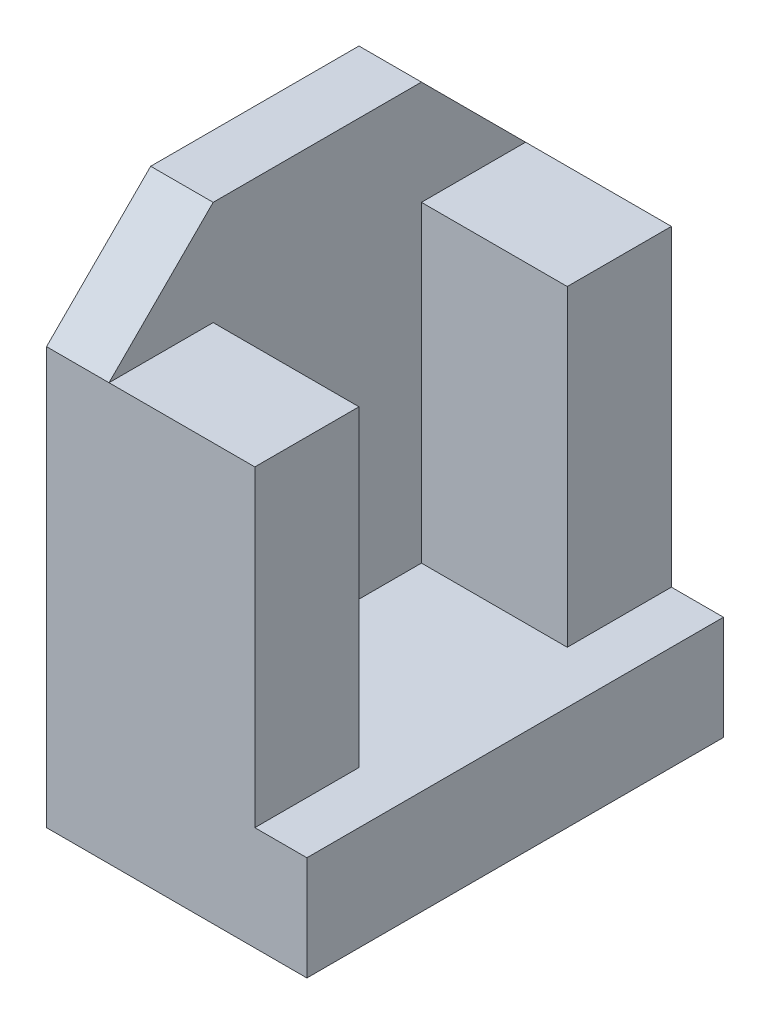
ISO-10303-21;
HEADER;
FILE_DESCRIPTION(('STEP AP214'),'2;1');
FILE_NAME('part.step','',(''),(''),'','','');
FILE_SCHEMA(('AUTOMOTIVE_DESIGN { 1 0 10303 214 1 1 1 1 }'));
ENDSEC;
DATA;
#1=APPLICATION_CONTEXT('core data for automotive mechanical design processes');
#2=APPLICATION_PROTOCOL_DEFINITION('international standard','automotive_design',2000,#1);
#3=PRODUCT_CONTEXT('',#1,'mechanical');
#4=PRODUCT('Part','Part','',(#3));
#5=PRODUCT_RELATED_PRODUCT_CATEGORY('part','',(#4));
#6=PRODUCT_DEFINITION_FORMATION('','',#4);
#7=PRODUCT_DEFINITION_CONTEXT('part definition',#1,'design');
#8=PRODUCT_DEFINITION('design','',#6,#7);
#9=PRODUCT_DEFINITION_SHAPE('','',#8);
#10=(LENGTH_UNIT() NAMED_UNIT(*) SI_UNIT(.MILLI.,.METRE.));
#11=(NAMED_UNIT(*) PLANE_ANGLE_UNIT() SI_UNIT($,.RADIAN.));
#12=(NAMED_UNIT(*) SI_UNIT($,.STERADIAN.) SOLID_ANGLE_UNIT());
#13=UNCERTAINTY_MEASURE_WITH_UNIT(LENGTH_MEASURE(1.E-05),#10,'distance_accuracy_value','');
#14=(GEOMETRIC_REPRESENTATION_CONTEXT(3) GLOBAL_UNCERTAINTY_ASSIGNED_CONTEXT((#13)) GLOBAL_UNIT_ASSIGNED_CONTEXT((#10,
#11,#12)) REPRESENTATION_CONTEXT('',''));
#15=CARTESIAN_POINT('',(0.,0.,0.));
#16=DIRECTION('',(0.,0.,1.));
#17=DIRECTION('',(1.,0.,0.));
#18=AXIS2_PLACEMENT_3D('',#15,#16,#17);
#19=CARTESIAN_POINT('',(6000.00000000001,0.,-40000.));
#20=DIRECTION('',(1.,0.,0.));
#21=DIRECTION('',(0.,0.,-1.));
#22=AXIS2_PLACEMENT_3D('',#19,#20,#21);
#23=PLANE('',#22);
#24=DIRECTION('',(0.,-1.,0.));
#25=VECTOR('',#24,1.);
#26=CARTESIAN_POINT('',(6000.00000000001,10000.,-30000.));
#27=LINE('',#26,#25);
#28=CARTESIAN_POINT('',(6000.00000000001,40000.,-30000.));
#29=VERTEX_POINT('',#28);
#30=CARTESIAN_POINT('',(6000.00000000001,10000.,-30000.));
#31=VERTEX_POINT('',#30);
#32=EDGE_CURVE('E52',#29,#31,#27,.T.);
#33=ORIENTED_EDGE('',*,*,#32,.F.);
#34=DIRECTION('',(0.,0.,1.));
#35=VECTOR('',#34,1.);
#36=CARTESIAN_POINT('',(6000.00000000001,40000.,-40000.));
#37=LINE('',#36,#35);
#38=CARTESIAN_POINT('',(6000.00000000001,40000.,-40000.));
#39=VERTEX_POINT('',#38);
#40=EDGE_CURVE('E252',#39,#29,#37,.T.);
#41=ORIENTED_EDGE('',*,*,#40,.F.);
#42=DIRECTION('',(0.,0.707106781186547,0.707106781186547));
#43=VECTOR('',#42,1.);
#44=CARTESIAN_POINT('',(6000.,50000.,-30000.));
#45=LINE('',#44,#43);
#46=CARTESIAN_POINT('',(6000.,50000.,-30000.));
#47=VERTEX_POINT('',#46);
#48=EDGE_CURVE('E192',#39,#47,#45,.T.);
#49=ORIENTED_EDGE('',*,*,#48,.T.);
#50=DIRECTION('',(0.,0.,1.));
#51=VECTOR('',#50,1.);
#52=CARTESIAN_POINT('',(6000.00000000001,50000.,-40000.));
#53=LINE('',#52,#51);
#54=CARTESIAN_POINT('',(6000.,50000.,-10000.));
#55=VERTEX_POINT('',#54);
#56=EDGE_CURVE('E11',#47,#55,#53,.T.);
#57=ORIENTED_EDGE('',*,*,#56,.T.);
#58=DIRECTION('',(0.,-0.707106781186547,0.707106781186547));
#59=VECTOR('',#58,1.);
#60=CARTESIAN_POINT('',(6000.,40000.,0.));
#61=LINE('',#60,#59);
#62=CARTESIAN_POINT('',(6000.,40000.,0.));
#63=VERTEX_POINT('',#62);
#64=EDGE_CURVE('E182',#55,#63,#61,.T.);
#65=ORIENTED_EDGE('',*,*,#64,.T.);
#66=DIRECTION('',(0.,0.,1.));
#67=VECTOR('',#66,1.);
#68=CARTESIAN_POINT('',(6000.00000000001,40000.,0.));
#69=LINE('',#68,#67);
#70=CARTESIAN_POINT('',(6000.00000000001,40000.,-10000.));
#71=VERTEX_POINT('',#70);
#72=EDGE_CURVE('E157',#71,#63,#69,.T.);
#73=ORIENTED_EDGE('',*,*,#72,.F.);
#74=DIRECTION('',(0.,1.,0.));
#75=VECTOR('',#74,1.);
#76=CARTESIAN_POINT('',(6000.00000000001,10000.,-10000.));
#77=LINE('',#76,#75);
#78=CARTESIAN_POINT('',(6000.00000000001,10000.,-10000.));
#79=VERTEX_POINT('',#78);
#80=EDGE_CURVE('E155',#79,#71,#77,.T.);
#81=ORIENTED_EDGE('',*,*,#80,.F.);
#82=DIRECTION('',(0.,0.,1.));
#83=VECTOR('',#82,1.);
#84=CARTESIAN_POINT('',(6000.00000000001,10000.,-40000.));
#85=LINE('',#84,#83);
#86=EDGE_CURVE('E44',#31,#79,#85,.T.);
#87=ORIENTED_EDGE('',*,*,#86,.F.);
#88=EDGE_LOOP('',(#33,#41,#49,#57,#65,#73,#81,#87));
#89=FACE_BOUND('',#88,.T.);
#90=ADVANCED_FACE('F35',(#89),#23,.T.);
#91=CARTESIAN_POINT('',(0.,10000.,-40000.));
#92=DIRECTION('',(0.,1.,0.));
#93=DIRECTION('',(0.,0.,1.));
#94=AXIS2_PLACEMENT_3D('',#91,#92,#93);
#95=PLANE('',#94);
#96=DIRECTION('',(0.,0.,-1.));
#97=VECTOR('',#96,1.);
#98=CARTESIAN_POINT('',(20000.,10000.,-40000.));
#99=LINE('',#98,#97);
#100=CARTESIAN_POINT('',(20000.,10000.,-30000.));
#101=VERTEX_POINT('',#100);
#102=CARTESIAN_POINT('',(20000.,10000.,-40000.));
#103=VERTEX_POINT('',#102);
#104=EDGE_CURVE('E60',#101,#103,#99,.T.);
#105=ORIENTED_EDGE('',*,*,#104,.F.);
#106=DIRECTION('',(-1.,0.,0.));
#107=VECTOR('',#106,1.);
#108=CARTESIAN_POINT('',(20000.,10000.,-30000.));
#109=LINE('',#108,#107);
#110=EDGE_CURVE('E159',#101,#31,#109,.T.);
#111=ORIENTED_EDGE('',*,*,#110,.T.);
#112=ORIENTED_EDGE('',*,*,#86,.T.);
#113=DIRECTION('',(-1.,0.,0.));
#114=VECTOR('',#113,1.);
#115=CARTESIAN_POINT('',(20000.,10000.,-10000.));
#116=LINE('',#115,#114);
#117=CARTESIAN_POINT('',(20000.,10000.,-10000.));
#118=VERTEX_POINT('',#117);
#119=EDGE_CURVE('E178',#118,#79,#116,.T.);
#120=ORIENTED_EDGE('',*,*,#119,.F.);
#121=DIRECTION('',(0.,0.,-1.));
#122=VECTOR('',#121,1.);
#123=CARTESIAN_POINT('',(20000.,10000.,0.));
#124=LINE('',#123,#122);
#125=CARTESIAN_POINT('',(20000.,10000.,0.));
#126=VERTEX_POINT('',#125);
#127=EDGE_CURVE('E165',#126,#118,#124,.T.);
#128=ORIENTED_EDGE('',*,*,#127,.F.);
#129=DIRECTION('',(-1.,0.,0.));
#130=VECTOR('',#129,1.);
#131=CARTESIAN_POINT('',(0.,10000.,0.));
#132=LINE('',#131,#130);
#133=CARTESIAN_POINT('',(25000.,10000.,0.));
#134=VERTEX_POINT('',#133);
#135=EDGE_CURVE('E204',#134,#126,#132,.T.);
#136=ORIENTED_EDGE('',*,*,#135,.F.);
#137=DIRECTION('',(0.,0.,1.));
#138=VECTOR('',#137,1.);
#139=CARTESIAN_POINT('',(25000.,10000.,-40000.));
#140=LINE('',#139,#138);
#141=CARTESIAN_POINT('',(25000.,10000.,-40000.));
#142=VERTEX_POINT('',#141);
#143=EDGE_CURVE('E222',#142,#134,#140,.T.);
#144=ORIENTED_EDGE('',*,*,#143,.F.);
#145=DIRECTION('',(-1.,0.,0.));
#146=VECTOR('',#145,1.);
#147=CARTESIAN_POINT('',(0.,10000.,-40000.));
#148=LINE('',#147,#146);
#149=EDGE_CURVE('E210',#142,#103,#148,.T.);
#150=ORIENTED_EDGE('',*,*,#149,.T.);
#151=EDGE_LOOP('',(#105,#111,#112,#120,#128,#136,#144,#150));
#152=FACE_BOUND('',#151,.T.);
#153=ADVANCED_FACE('F266',(#152),#95,.T.);
#154=CARTESIAN_POINT('',(0.,50000.,-40000.));
#155=DIRECTION('',(0.,1.,0.));
#156=DIRECTION('',(0.,0.,1.));
#157=AXIS2_PLACEMENT_3D('',#154,#155,#156);
#158=PLANE('',#157);
#159=DIRECTION('',(-1.,0.,0.));
#160=VECTOR('',#159,1.);
#161=CARTESIAN_POINT('',(6000.,50000.,-10000.));
#162=LINE('',#161,#160);
#163=CARTESIAN_POINT('',(1.14558629826442E-12,50000.,-10000.));
#164=VERTEX_POINT('',#163);
#165=EDGE_CURVE('E187',#55,#164,#162,.T.);
#166=ORIENTED_EDGE('',*,*,#165,.F.);
#167=ORIENTED_EDGE('',*,*,#56,.F.);
#168=DIRECTION('',(-1.,0.,0.));
#169=VECTOR('',#168,1.);
#170=CARTESIAN_POINT('',(6000.,50000.,-30000.));
#171=LINE('',#170,#169);
#172=CARTESIAN_POINT('',(1.14558629826442E-12,50000.,-30000.));
#173=VERTEX_POINT('',#172);
#174=EDGE_CURVE('E196',#47,#173,#171,.T.);
#175=ORIENTED_EDGE('',*,*,#174,.T.);
#176=DIRECTION('',(0.,0.,1.));
#177=VECTOR('',#176,1.);
#178=CARTESIAN_POINT('',(1.14558629944844E-12,50000.,-40000.));
#179=LINE('',#178,#177);
#180=EDGE_CURVE('E39',#173,#164,#179,.T.);
#181=ORIENTED_EDGE('',*,*,#180,.T.);
#182=EDGE_LOOP('',(#166,#167,#175,#181));
#183=FACE_BOUND('',#182,.T.);
#184=ADVANCED_FACE('F37',(#183),#158,.T.);
#185=CARTESIAN_POINT('',(25000.,8.88178419700125E-12,-40000.));
#186=DIRECTION('',(1.,0.,0.));
#187=DIRECTION('',(0.,1.,0.));
#188=AXIS2_PLACEMENT_3D('',#185,#186,#187);
#189=PLANE('',#188);
#190=DIRECTION('',(0.,1.,0.));
#191=VECTOR('',#190,1.);
#192=CARTESIAN_POINT('',(25000.,8.88178419700125E-12,0.));
#193=LINE('',#192,#191);
#194=CARTESIAN_POINT('',(25000.,0.,0.));
#195=VERTEX_POINT('',#194);
#196=EDGE_CURVE('E216',#195,#134,#193,.T.);
#197=ORIENTED_EDGE('',*,*,#196,.F.);
#198=DIRECTION('',(0.,0.,1.));
#199=VECTOR('',#198,1.);
#200=CARTESIAN_POINT('',(25000.,0.,-40000.));
#201=LINE('',#200,#199);
#202=CARTESIAN_POINT('',(25000.,0.,-40000.));
#203=VERTEX_POINT('',#202);
#204=EDGE_CURVE('E224',#203,#195,#201,.T.);
#205=ORIENTED_EDGE('',*,*,#204,.F.);
#206=DIRECTION('',(0.,1.,0.));
#207=VECTOR('',#206,1.);
#208=CARTESIAN_POINT('',(25000.,8.88178419700125E-12,-40000.));
#209=LINE('',#208,#207);
#210=EDGE_CURVE('E207',#203,#142,#209,.T.);
#211=ORIENTED_EDGE('',*,*,#210,.T.);
#212=ORIENTED_EDGE('',*,*,#143,.T.);
#213=EDGE_LOOP('',(#197,#205,#211,#212));
#214=FACE_BOUND('',#213,.T.);
#215=ADVANCED_FACE('F273',(#214),#189,.T.);
#216=CARTESIAN_POINT('',(0.,0.,-40000.));
#217=DIRECTION('',(0.,-1.,0.));
#218=DIRECTION('',(0.,0.,-1.));
#219=AXIS2_PLACEMENT_3D('',#216,#217,#218);
#220=PLANE('',#219);
#221=DIRECTION('',(1.,0.,0.));
#222=VECTOR('',#221,1.);
#223=CARTESIAN_POINT('',(0.,0.,0.));
#224=LINE('',#223,#222);
#225=CARTESIAN_POINT('',(0.,0.,0.));
#226=VERTEX_POINT('',#225);
#227=EDGE_CURVE('E213',#226,#195,#224,.T.);
#228=ORIENTED_EDGE('',*,*,#227,.F.);
#229=DIRECTION('',(0.,0.,1.));
#230=VECTOR('',#229,1.);
#231=CARTESIAN_POINT('',(0.,0.,-40000.));
#232=LINE('',#231,#230);
#233=CARTESIAN_POINT('',(0.,0.,-40000.));
#234=VERTEX_POINT('',#233);
#235=EDGE_CURVE('E225',#234,#226,#232,.T.);
#236=ORIENTED_EDGE('',*,*,#235,.F.);
#237=DIRECTION('',(1.,0.,0.));
#238=VECTOR('',#237,1.);
#239=CARTESIAN_POINT('',(0.,0.,-40000.));
#240=LINE('',#239,#238);
#241=EDGE_CURVE('E203',#234,#203,#240,.T.);
#242=ORIENTED_EDGE('',*,*,#241,.T.);
#243=ORIENTED_EDGE('',*,*,#204,.T.);
#244=EDGE_LOOP('',(#228,#236,#242,#243));
#245=FACE_BOUND('',#244,.T.);
#246=ADVANCED_FACE('F276',(#245),#220,.T.);
#247=CARTESIAN_POINT('',(0.,0.,-40000.));
#248=DIRECTION('',(-1.,0.,0.));
#249=DIRECTION('',(0.,-1.,0.));
#250=AXIS2_PLACEMENT_3D('',#247,#248,#249);
#251=PLANE('',#250);
#252=DIRECTION('',(0.,-0.707106781186547,0.707106781186547));
#253=VECTOR('',#252,1.);
#254=CARTESIAN_POINT('',(9.16469038611537E-13,40000.,0.));
#255=LINE('',#254,#253);
#256=CARTESIAN_POINT('',(9.16469038611537E-13,40000.,0.));
#257=VERTEX_POINT('',#256);
#258=EDGE_CURVE('E181',#164,#257,#255,.T.);
#259=ORIENTED_EDGE('',*,*,#258,.F.);
#260=ORIENTED_EDGE('',*,*,#180,.F.);
#261=DIRECTION('',(0.,0.707106781186547,0.707106781186547));
#262=VECTOR('',#261,1.);
#263=CARTESIAN_POINT('',(1.14558629826442E-12,50000.,-30000.));
#264=LINE('',#263,#262);
#265=CARTESIAN_POINT('',(9.16469038611537E-13,40000.,-40000.));
#266=VERTEX_POINT('',#265);
#267=EDGE_CURVE('E189',#266,#173,#264,.T.);
#268=ORIENTED_EDGE('',*,*,#267,.F.);
#269=DIRECTION('',(0.,-1.,0.));
#270=VECTOR('',#269,1.);
#271=CARTESIAN_POINT('',(0.,0.,-40000.));
#272=LINE('',#271,#270);
#273=EDGE_CURVE('E201',#266,#234,#272,.T.);
#274=ORIENTED_EDGE('',*,*,#273,.T.);
#275=ORIENTED_EDGE('',*,*,#235,.T.);
#276=DIRECTION('',(0.,-1.,0.));
#277=VECTOR('',#276,1.);
#278=CARTESIAN_POINT('',(0.,0.,0.));
#279=LINE('',#278,#277);
#280=EDGE_CURVE('E199',#257,#226,#279,.T.);
#281=ORIENTED_EDGE('',*,*,#280,.F.);
#282=EDGE_LOOP('',(#259,#260,#268,#274,#275,#281));
#283=FACE_BOUND('',#282,.T.);
#284=ADVANCED_FACE('F238',(#283),#251,.T.);
#285=CARTESIAN_POINT('',(0.,0.,-40000.));
#286=DIRECTION('',(0.,0.,1.));
#287=DIRECTION('',(1.,0.,0.));
#288=AXIS2_PLACEMENT_3D('',#285,#286,#287);
#289=PLANE('',#288);
#290=ORIENTED_EDGE('',*,*,#273,.F.);
#291=DIRECTION('',(-1.,0.,0.));
#292=VECTOR('',#291,1.);
#293=CARTESIAN_POINT('',(6000.,40000.,-40000.));
#294=LINE('',#293,#292);
#295=EDGE_CURVE('E153',#39,#266,#294,.T.);
#296=ORIENTED_EDGE('',*,*,#295,.F.);
#297=DIRECTION('',(-1.,0.,0.));
#298=VECTOR('',#297,1.);
#299=CARTESIAN_POINT('',(20000.,40000.,-40000.));
#300=LINE('',#299,#298);
#301=CARTESIAN_POINT('',(20000.,40000.,-40000.));
#302=VERTEX_POINT('',#301);
#303=EDGE_CURVE('E138',#302,#39,#300,.T.);
#304=ORIENTED_EDGE('',*,*,#303,.F.);
#305=DIRECTION('',(0.,1.,0.));
#306=VECTOR('',#305,1.);
#307=CARTESIAN_POINT('',(20000.,10000.,-40000.));
#308=LINE('',#307,#306);
#309=EDGE_CURVE('E144',#103,#302,#308,.T.);
#310=ORIENTED_EDGE('',*,*,#309,.F.);
#311=ORIENTED_EDGE('',*,*,#149,.F.);
#312=ORIENTED_EDGE('',*,*,#210,.F.);
#313=ORIENTED_EDGE('',*,*,#241,.F.);
#314=EDGE_LOOP('',(#290,#296,#304,#310,#311,#312,#313));
#315=FACE_BOUND('',#314,.T.);
#316=ADVANCED_FACE('F152',(#315),#289,.F.);
#317=CARTESIAN_POINT('',(0.,0.,0.));
#318=DIRECTION('',(0.,0.,1.));
#319=DIRECTION('',(1.,0.,0.));
#320=AXIS2_PLACEMENT_3D('',#317,#318,#319);
#321=PLANE('',#320);
#322=DIRECTION('',(-1.,0.,0.));
#323=VECTOR('',#322,1.);
#324=CARTESIAN_POINT('',(6000.,40000.,0.));
#325=LINE('',#324,#323);
#326=EDGE_CURVE('E185',#63,#257,#325,.T.);
#327=ORIENTED_EDGE('',*,*,#326,.T.);
#328=ORIENTED_EDGE('',*,*,#280,.T.);
#329=ORIENTED_EDGE('',*,*,#227,.T.);
#330=ORIENTED_EDGE('',*,*,#196,.T.);
#331=ORIENTED_EDGE('',*,*,#135,.T.);
#332=DIRECTION('',(0.,-1.,0.));
#333=VECTOR('',#332,1.);
#334=CARTESIAN_POINT('',(20000.,10000.,0.));
#335=LINE('',#334,#333);
#336=CARTESIAN_POINT('',(20000.,40000.,0.));
#337=VERTEX_POINT('',#336);
#338=EDGE_CURVE('E163',#337,#126,#335,.T.);
#339=ORIENTED_EDGE('',*,*,#338,.F.);
#340=DIRECTION('',(-1.,0.,0.));
#341=VECTOR('',#340,1.);
#342=CARTESIAN_POINT('',(20000.,40000.,0.));
#343=LINE('',#342,#341);
#344=EDGE_CURVE('E170',#337,#63,#343,.T.);
#345=ORIENTED_EDGE('',*,*,#344,.T.);
#346=EDGE_LOOP('',(#327,#328,#329,#330,#331,#339,#345));
#347=FACE_BOUND('',#346,.T.);
#348=ADVANCED_FACE('F243',(#347),#321,.T.);
#349=CARTESIAN_POINT('',(6000.,50000.,-30000.));
#350=DIRECTION('',(0.,-0.707106781186548,0.707106781186548));
#351=DIRECTION('',(0.,-0.707106781186548,-0.707106781186548));
#352=AXIS2_PLACEMENT_3D('',#349,#350,#351);
#353=PLANE('',#352);
#354=ORIENTED_EDGE('',*,*,#267,.T.);
#355=ORIENTED_EDGE('',*,*,#174,.F.);
#356=ORIENTED_EDGE('',*,*,#48,.F.);
#357=ORIENTED_EDGE('',*,*,#295,.T.);
#358=EDGE_LOOP('',(#354,#355,#356,#357));
#359=FACE_BOUND('',#358,.T.);
#360=ADVANCED_FACE('F254',(#359),#353,.F.);
#361=CARTESIAN_POINT('',(6000.,40000.,0.));
#362=DIRECTION('',(0.,-0.707106781186548,-0.707106781186548));
#363=DIRECTION('',(0.,0.707106781186548,-0.707106781186548));
#364=AXIS2_PLACEMENT_3D('',#361,#362,#363);
#365=PLANE('',#364);
#366=ORIENTED_EDGE('',*,*,#258,.T.);
#367=ORIENTED_EDGE('',*,*,#326,.F.);
#368=ORIENTED_EDGE('',*,*,#64,.F.);
#369=ORIENTED_EDGE('',*,*,#165,.T.);
#370=EDGE_LOOP('',(#366,#367,#368,#369));
#371=FACE_BOUND('',#370,.T.);
#372=ADVANCED_FACE('F241',(#371),#365,.F.);
#373=CARTESIAN_POINT('',(20000.,10000.,-10000.));
#374=DIRECTION('',(0.,0.,1.));
#375=DIRECTION('',(1.,0.,0.));
#376=AXIS2_PLACEMENT_3D('',#373,#374,#375);
#377=PLANE('',#376);
#378=ORIENTED_EDGE('',*,*,#80,.T.);
#379=DIRECTION('',(-1.,0.,0.));
#380=VECTOR('',#379,1.);
#381=CARTESIAN_POINT('',(20000.,40000.,-10000.));
#382=LINE('',#381,#380);
#383=CARTESIAN_POINT('',(20000.,40000.,-10000.));
#384=VERTEX_POINT('',#383);
#385=EDGE_CURVE('E175',#384,#71,#382,.T.);
#386=ORIENTED_EDGE('',*,*,#385,.F.);
#387=DIRECTION('',(0.,1.,0.));
#388=VECTOR('',#387,1.);
#389=CARTESIAN_POINT('',(20000.,10000.,-10000.));
#390=LINE('',#389,#388);
#391=EDGE_CURVE('E167',#118,#384,#390,.T.);
#392=ORIENTED_EDGE('',*,*,#391,.F.);
#393=ORIENTED_EDGE('',*,*,#119,.T.);
#394=EDGE_LOOP('',(#378,#386,#392,#393));
#395=FACE_BOUND('',#394,.T.);
#396=ADVANCED_FACE('F261',(#395),#377,.F.);
#397=CARTESIAN_POINT('',(20000.,40000.,0.));
#398=DIRECTION('',(0.,-1.,0.));
#399=DIRECTION('',(0.,0.,-1.));
#400=AXIS2_PLACEMENT_3D('',#397,#398,#399);
#401=PLANE('',#400);
#402=ORIENTED_EDGE('',*,*,#72,.T.);
#403=ORIENTED_EDGE('',*,*,#344,.F.);
#404=DIRECTION('',(0.,0.,1.));
#405=VECTOR('',#404,1.);
#406=CARTESIAN_POINT('',(20000.,40000.,0.));
#407=LINE('',#406,#405);
#408=EDGE_CURVE('E169',#384,#337,#407,.T.);
#409=ORIENTED_EDGE('',*,*,#408,.F.);
#410=ORIENTED_EDGE('',*,*,#385,.T.);
#411=EDGE_LOOP('',(#402,#403,#409,#410));
#412=FACE_BOUND('',#411,.T.);
#413=ADVANCED_FACE('F249',(#412),#401,.F.);
#414=CARTESIAN_POINT('',(20000.,0.,0.));
#415=DIRECTION('',(-1.,0.,0.));
#416=DIRECTION('',(0.,0.,1.));
#417=AXIS2_PLACEMENT_3D('',#414,#415,#416);
#418=PLANE('',#417);
#419=ORIENTED_EDGE('',*,*,#338,.T.);
#420=ORIENTED_EDGE('',*,*,#127,.T.);
#421=ORIENTED_EDGE('',*,*,#391,.T.);
#422=ORIENTED_EDGE('',*,*,#408,.T.);
#423=EDGE_LOOP('',(#419,#420,#421,#422));
#424=FACE_BOUND('',#423,.T.);
#425=ADVANCED_FACE('F318',(#424),#418,.F.);
#426=CARTESIAN_POINT('',(20000.,40000.,-40000.));
#427=DIRECTION('',(0.,-1.,0.));
#428=DIRECTION('',(0.,0.,-1.));
#429=AXIS2_PLACEMENT_3D('',#426,#427,#428);
#430=PLANE('',#429);
#431=ORIENTED_EDGE('',*,*,#40,.T.);
#432=DIRECTION('',(-1.,0.,0.));
#433=VECTOR('',#432,1.);
#434=CARTESIAN_POINT('',(20000.,40000.,-30000.));
#435=LINE('',#434,#433);
#436=CARTESIAN_POINT('',(20000.,40000.,-30000.));
#437=VERTEX_POINT('',#436);
#438=EDGE_CURVE('E140',#437,#29,#435,.T.);
#439=ORIENTED_EDGE('',*,*,#438,.F.);
#440=DIRECTION('',(0.,0.,1.));
#441=VECTOR('',#440,1.);
#442=CARTESIAN_POINT('',(20000.,40000.,-40000.));
#443=LINE('',#442,#441);
#444=EDGE_CURVE('E134',#302,#437,#443,.T.);
#445=ORIENTED_EDGE('',*,*,#444,.F.);
#446=ORIENTED_EDGE('',*,*,#303,.T.);
#447=EDGE_LOOP('',(#431,#439,#445,#446));
#448=FACE_BOUND('',#447,.T.);
#449=ADVANCED_FACE('F136',(#448),#430,.F.);
#450=CARTESIAN_POINT('',(20000.,10000.,-30000.));
#451=DIRECTION('',(0.,0.,-1.));
#452=DIRECTION('',(-1.,0.,0.));
#453=AXIS2_PLACEMENT_3D('',#450,#451,#452);
#454=PLANE('',#453);
#455=ORIENTED_EDGE('',*,*,#32,.T.);
#456=ORIENTED_EDGE('',*,*,#110,.F.);
#457=DIRECTION('',(0.,-1.,0.));
#458=VECTOR('',#457,1.);
#459=CARTESIAN_POINT('',(20000.,10000.,-30000.));
#460=LINE('',#459,#458);
#461=EDGE_CURVE('E143',#437,#101,#460,.T.);
#462=ORIENTED_EDGE('',*,*,#461,.F.);
#463=ORIENTED_EDGE('',*,*,#438,.T.);
#464=EDGE_LOOP('',(#455,#456,#462,#463));
#465=FACE_BOUND('',#464,.T.);
#466=ADVANCED_FACE('F336',(#465),#454,.F.);
#467=CARTESIAN_POINT('',(20000.,0.,0.));
#468=DIRECTION('',(1.,0.,0.));
#469=DIRECTION('',(0.,0.,-1.));
#470=AXIS2_PLACEMENT_3D('',#467,#468,#469);
#471=PLANE('',#470);
#472=ORIENTED_EDGE('',*,*,#309,.T.);
#473=ORIENTED_EDGE('',*,*,#444,.T.);
#474=ORIENTED_EDGE('',*,*,#461,.T.);
#475=ORIENTED_EDGE('',*,*,#104,.T.);
#476=EDGE_LOOP('',(#472,#473,#474,#475));
#477=FACE_BOUND('',#476,.T.);
#478=ADVANCED_FACE('F147',(#477),#471,.T.);
#479=CLOSED_SHELL('',(#90,#153,#184,#215,#246,#284,#316,#348,#360,#372,#396,#413,#425,#449,#466,#478));
#480=MANIFOLD_SOLID_BREP('B2',#479);
#481=ADVANCED_BREP_SHAPE_REPRESENTATION('',(#18,#480),#14);
#482=SHAPE_DEFINITION_REPRESENTATION(#9,#481);
ENDSEC;
END-ISO-10303-21;
